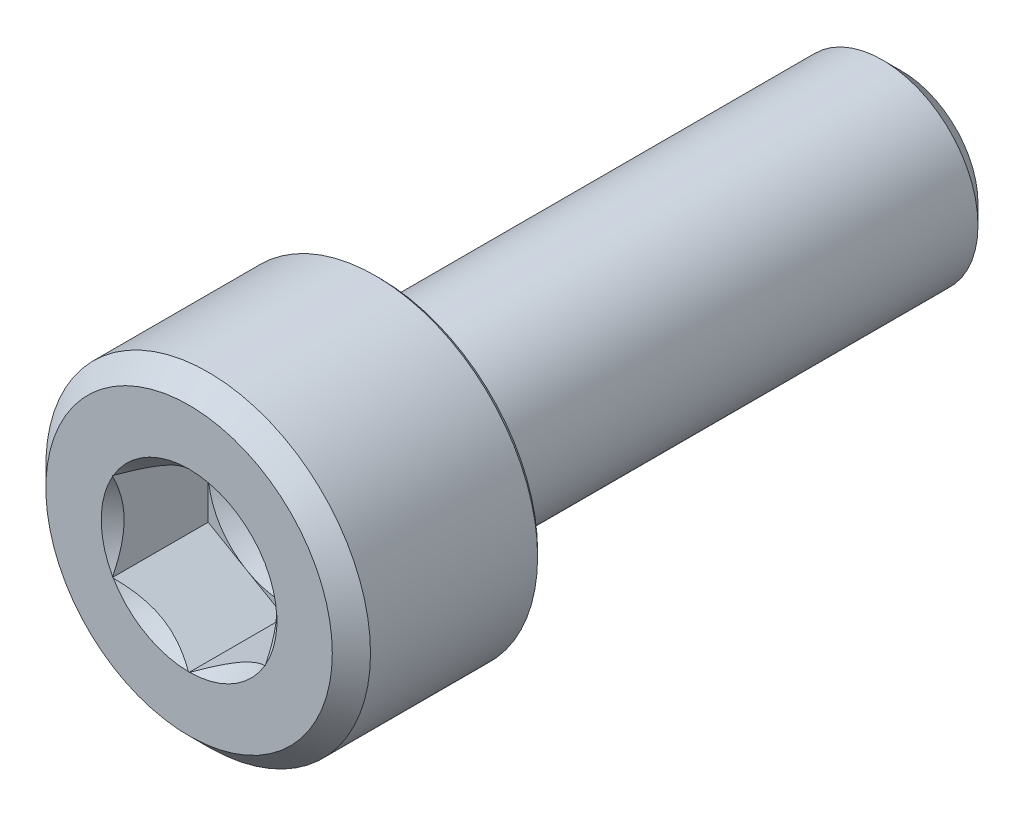
ISO-10303-21;
HEADER;
FILE_DESCRIPTION(('STEP AP214'),'2;1');
FILE_NAME('part.step','',(''),(''),'','','');
FILE_SCHEMA(('AUTOMOTIVE_DESIGN { 1 0 10303 214 1 1 1 1 }'));
ENDSEC;
DATA;
#1=APPLICATION_CONTEXT('core data for automotive mechanical design processes');
#2=APPLICATION_PROTOCOL_DEFINITION('international standard','automotive_design',2000,#1);
#3=PRODUCT_CONTEXT('',#1,'mechanical');
#4=PRODUCT('Part','Part','',(#3));
#5=PRODUCT_RELATED_PRODUCT_CATEGORY('part','',(#4));
#6=PRODUCT_DEFINITION_FORMATION('','',#4);
#7=PRODUCT_DEFINITION_CONTEXT('part definition',#1,'design');
#8=PRODUCT_DEFINITION('design','',#6,#7);
#9=PRODUCT_DEFINITION_SHAPE('','',#8);
#10=(LENGTH_UNIT() NAMED_UNIT(*) SI_UNIT(.MILLI.,.METRE.));
#11=(NAMED_UNIT(*) PLANE_ANGLE_UNIT() SI_UNIT($,.RADIAN.));
#12=(NAMED_UNIT(*) SI_UNIT($,.STERADIAN.) SOLID_ANGLE_UNIT());
#13=UNCERTAINTY_MEASURE_WITH_UNIT(LENGTH_MEASURE(1.E-05),#10,'distance_accuracy_value','');
#14=(GEOMETRIC_REPRESENTATION_CONTEXT(3) GLOBAL_UNCERTAINTY_ASSIGNED_CONTEXT((#13)) GLOBAL_UNIT_ASSIGNED_CONTEXT((#10,
#11,#12)) REPRESENTATION_CONTEXT('',''));
#15=CARTESIAN_POINT('',(0.,0.,0.));
#16=DIRECTION('',(0.,0.,1.));
#17=DIRECTION('',(1.,0.,0.));
#18=AXIS2_PLACEMENT_3D('',#15,#16,#17);
#19=CARTESIAN_POINT('',(0.,0.,3.65470053837925));
#20=DIRECTION('',(0.,0.,1.));
#21=DIRECTION('',(1.,0.,0.));
#22=AXIS2_PLACEMENT_3D('',#19,#20,#21);
#23=CONICAL_SURFACE('',#22,2.3,0.785398163397447);
#24=CARTESIAN_POINT('',(0.,0.,3.65470053837925));
#25=DIRECTION('',(0.,0.,1.));
#26=DIRECTION('',(1.,0.,0.));
#27=AXIS2_PLACEMENT_3D('',#24,#25,#26);
#28=CIRCLE('',#27,2.3);
#29=CARTESIAN_POINT('',(1.9836157786453,1.16415997298885,3.65470053837925));
#30=VERTEX_POINT('',#29);
#31=CARTESIAN_POINT('',(0.0163842213546962,2.2999416421489,3.65470053837925));
#32=VERTEX_POINT('',#31);
#33=EDGE_CURVE('E288',#30,#32,#28,.T.);
#34=ORIENTED_EDGE('',*,*,#33,.T.);
#35=CARTESIAN_POINT('',(0.0160335219124527,2.30014411856629,3.65490053837925));
#36=CARTESIAN_POINT('',(0.0838218716356483,2.26100649660568,3.61626977955249));
#37=CARTESIAN_POINT('',(0.152733940109913,2.22122009532165,3.5799513522365));
#38=CARTESIAN_POINT('',(0.293197345556135,2.14012351037598,3.513531403163));
#39=CARTESIAN_POINT('',(0.364761220332721,2.09880608800947,3.48346554819174));
#40=CARTESIAN_POINT('',(0.509055151253177,2.01549794815011,3.43200858947481));
#41=CARTESIAN_POINT('',(0.581750643043778,1.97352718639594,3.41049187089558));
#42=CARTESIAN_POINT('',(0.728695013519788,1.88868881454571,3.3773868739903));
#43=CARTESIAN_POINT('',(0.802939747411757,1.84582359744727,3.36577490198982));
#44=CARTESIAN_POINT('',(0.931694200760393,1.77148717914707,3.35527820444975));
#45=CARTESIAN_POINT('',(0.986050156804239,1.7401047532931,3.35378190690452));
#46=CARTESIAN_POINT('',(1.09466381191244,1.67739663027871,3.35670481363054));
#47=CARTESIAN_POINT('',(1.14892147075466,1.64607095634056,3.36112605255251));
#48=CARTESIAN_POINT('',(1.25691420441069,1.58372132249372,3.37563190528028));
#49=CARTESIAN_POINT('',(1.31064866719856,1.55269771593839,3.38572249177389));
#50=CARTESIAN_POINT('',(1.41718462269261,1.49118915335552,3.41101533780433));
#51=CARTESIAN_POINT('',(1.46998619003367,1.46070415423753,3.42621718645553));
#52=CARTESIAN_POINT('',(1.60199890807377,1.38448657594063,3.47022049295055));
#53=CARTESIAN_POINT('',(1.68047591324345,1.33917785588071,3.50196798692223));
#54=CARTESIAN_POINT('',(1.79595644222972,1.27250514138433,3.55539885052604));
#55=CARTESIAN_POINT('',(1.83402494324654,1.25052628207463,3.57414666618547));
#56=CARTESIAN_POINT('',(1.90948572309096,1.20695898051819,3.61332385139232));
#57=CARTESIAN_POINT('',(1.94687833497586,1.18537034598074,3.63375236357787));
#58=CARTESIAN_POINT('',(1.98396647808799,1.16395749657121,3.6549005383795));
#59=B_SPLINE_CURVE_WITH_KNOTS('',3,(#35,#36,#37,#38,#39,#40,#41,#42,#43,#44,#45,#46,#47,#48,#49,
#50,#51,#52,#53,#54,#55,#56,#57,#58),.UNSPECIFIED.,.F.,.F.,(4,2,2,2,2,2,2,2,2,2,2,4),(0.,
0.262041445010615,0.525538972003709,0.785007390559774,1.04385336605311,1.23193452890288,
1.4200803770827,1.60842481058421,1.79675410701709,2.08425218234595,2.22759444831597,
2.3708640401824),.UNSPECIFIED.);
#60=EDGE_CURVE('E246',#32,#30,#59,.T.);
#61=ORIENTED_EDGE('',*,*,#60,.T.);
#62=EDGE_LOOP('',(#34,#61));
#63=FACE_BOUND('',#62,.T.);
#64=ADVANCED_FACE('F36',(#63),#23,.F.);
#65=CARTESIAN_POINT('',(1.99999999999999,-1.13578166916007,3.65470053837925));
#66=VERTEX_POINT('',#65);
#67=CARTESIAN_POINT('',(1.99999999999999,1.13578166916007,3.65470053837925));
#68=VERTEX_POINT('',#67);
#69=EDGE_CURVE('E284',#66,#68,#28,.T.);
#70=ORIENTED_EDGE('',*,*,#69,.T.);
#71=CARTESIAN_POINT('',(1.99999999999999,3.4837056683404,5.37169010565809));
#72=CARTESIAN_POINT('',(1.99999999999999,3.38064544243507,5.28234698327698));
#73=CARTESIAN_POINT('',(1.99999999999999,3.27712654861634,5.19352202146325));
#74=CARTESIAN_POINT('',(1.99999999999999,3.06881584268026,5.01727790635607));
#75=CARTESIAN_POINT('',(1.99999999999999,2.964023447985,4.92985944251006));
#76=CARTESIAN_POINT('',(1.99999999999999,2.75047598433241,4.75489125618626));
#77=CARTESIAN_POINT('',(1.99999999999999,2.641685240832,4.66738490275798));
#78=CARTESIAN_POINT('',(1.99999999999999,2.42205041382861,4.49503242825231));
#79=CARTESIAN_POINT('',(1.99999999999999,2.31120685197181,4.41018564570945));
#80=CARTESIAN_POINT('',(1.99999999999999,2.0866375627447,4.24404809932447));
#81=CARTESIAN_POINT('',(1.99999999999999,1.97290816048253,4.16276227020368));
#82=CARTESIAN_POINT('',(1.99999999999999,1.74170238089295,4.00542360188487));
#83=CARTESIAN_POINT('',(1.99999999999999,1.62422304260943,3.92937505552962));
#84=CARTESIAN_POINT('',(1.99999999999999,1.38535336067468,3.78577771549349));
#85=CARTESIAN_POINT('',(1.99999999999999,1.26400028620497,3.71816774062344));
#86=CARTESIAN_POINT('',(1.99999999999999,1.01530632042797,3.59506201192209));
#87=CARTESIAN_POINT('',(1.99999999999999,0.887976987363086,3.53954395757193));
#88=CARTESIAN_POINT('',(1.99999999999999,0.690514411668279,3.46962905630233));
#89=CARTESIAN_POINT('',(1.99999999999999,0.622814904881047,3.44839077860405));
#90=CARTESIAN_POINT('',(1.99999999999999,0.48582308189195,3.41180277483204));
#91=CARTESIAN_POINT('',(1.99999999999999,0.416531021818052,3.39645210879012));
#92=CARTESIAN_POINT('',(1.99999999999999,0.277188402722413,3.37265910234162));
#93=CARTESIAN_POINT('',(1.99999999999999,0.207145152564436,3.36417475921466));
#94=CARTESIAN_POINT('',(1.99999999999999,0.0665510108308115,3.35457908188773));
#95=CARTESIAN_POINT('',(1.99999999999999,-0.00399982689904975,3.35346697684417));
#96=CARTESIAN_POINT('',(1.99999999999999,-0.144908272635511,3.35870484143565));
#97=CARTESIAN_POINT('',(1.99999999999999,-0.215265516520849,3.3650643882304));
#98=CARTESIAN_POINT('',(1.99999999999999,-0.354985397066574,3.38478048863059));
#99=CARTESIAN_POINT('',(1.99999999999999,-0.424347835333938,3.39813841851741));
#100=CARTESIAN_POINT('',(1.99999999999999,-0.562067833775433,3.43109464086447));
#101=CARTESIAN_POINT('',(1.99999999999999,-0.63041478174547,3.45073650875763));
#102=CARTESIAN_POINT('',(1.99999999999999,-0.765375927719188,3.49519990986254));
#103=CARTESIAN_POINT('',(1.99999999999999,-0.831990107140475,3.52002149859642));
#104=CARTESIAN_POINT('',(1.99999999999999,-0.978344560911979,3.57995191814828));
#105=CARTESIAN_POINT('',(1.99999999999999,-1.05764831161053,3.61611784331519));
#106=CARTESIAN_POINT('',(1.99999999999999,-1.21389410177411,3.69327289999961));
#107=CARTESIAN_POINT('',(1.99999999999999,-1.29083474353057,3.73426481922344));
#108=CARTESIAN_POINT('',(1.99999999999999,-1.44278995357122,3.81999992675208));
#109=CARTESIAN_POINT('',(1.99999999999999,-1.51780019983944,3.86475071309076));
#110=CARTESIAN_POINT('',(1.99999999999999,-1.66603498380282,3.95706725542144));
#111=CARTESIAN_POINT('',(1.99999999999999,-1.73925987276436,4.0046324512678));
#112=CARTESIAN_POINT('',(1.99999999999999,-1.88461254139945,4.1022172072051));
#113=CARTESIAN_POINT('',(1.99999999999999,-1.95673244637467,4.15224844258036));
#114=CARTESIAN_POINT('',(1.99999999999999,-2.0997242908128,4.25406769949909));
#115=CARTESIAN_POINT('',(1.99999999999999,-2.17059613561162,4.30585585343864));
#116=CARTESIAN_POINT('',(1.99999999999999,-2.38148237368524,4.463180913558));
#117=CARTESIAN_POINT('',(1.99999999999999,-2.51994258602376,4.5707985846889));
#118=CARTESIAN_POINT('',(1.99999999999999,-2.79804246494446,4.79299661482444));
#119=CARTESIAN_POINT('',(1.99999999999999,-2.93759167203103,4.90768908226659));
#120=CARTESIAN_POINT('',(1.99999999999999,-3.1444630544826,5.08112887345926));
#121=CARTESIAN_POINT('',(1.99999999999999,-3.21264477531068,5.13885589177048));
#122=CARTESIAN_POINT('',(1.99999999999999,-3.34852121502818,5.25487333724658));
#123=CARTESIAN_POINT('',(1.99999999999999,-3.416215959252,5.31316373472708));
#124=CARTESIAN_POINT('',(1.99999999999999,-3.4837056683404,5.37169010565809));
#125=B_SPLINE_CURVE_WITH_KNOTS('',3,(#71,#72,#73,#74,#75,#76,#77,#78,#79,#80,#81,#82,#83,#84,
#85,#86,#87,#88,#89,#90,#91,#92,#93,#94,#95,#96,#97,#98,#99,#100,#101,#102,#103,#104,#105,#106,
#107,#108,#109,#110,#111,#112,#113,#114,#115,#116,#117,#118,#119,#120,#121,#122,#123,#124),
.UNSPECIFIED.,.F.,.F.,(4,2,2,2,2,2,2,2,2,2,2,2,2,2,2,2,2,2,2,2,2,2,2,2,2,2,4),(0.,
0.409194059342149,0.818582938159623,1.23740286458969,1.65611778565292,2.07539569972372,
2.49501329059275,2.91138596426504,3.32698411557696,3.53962974468632,3.75224141037833,
3.96354244131151,4.17482137819207,4.38637142804252,4.59796309632632,4.81105504535252,
5.02414927865809,5.28541077842604,5.54682394170922,5.80877885453894,6.07068180530281,
6.33397327955596,6.59728463892513,7.12327074296493,7.66512681121564,7.93313622584972,
8.20113159526818),.UNSPECIFIED.);
#126=EDGE_CURVE('E254',#68,#66,#125,.T.);
#127=ORIENTED_EDGE('',*,*,#126,.T.);
#128=EDGE_LOOP('',(#70,#127));
#129=FACE_BOUND('',#128,.T.);
#130=ADVANCED_FACE('F349',(#129),#23,.F.);
#131=CARTESIAN_POINT('',(0.0163842213546949,-2.2999416421489,3.65470053837925));
#132=VERTEX_POINT('',#131);
#133=CARTESIAN_POINT('',(1.9836157786453,-1.16415997298885,3.65470053837925));
#134=VERTEX_POINT('',#133);
#135=EDGE_CURVE('E287',#132,#134,#28,.T.);
#136=ORIENTED_EDGE('',*,*,#135,.T.);
#137=CARTESIAN_POINT('',(1.98396647808799,-1.16395749657121,3.6549005383795));
#138=CARTESIAN_POINT('',(1.91617812836477,-1.20309511853183,3.61626977955272));
#139=CARTESIAN_POINT('',(1.84726605989048,-1.24288151981587,3.5799513522367));
#140=CARTESIAN_POINT('',(1.7068026544442,-1.32397810476157,3.51353140316315));
#141=CARTESIAN_POINT('',(1.63523877966758,-1.3652955271281,3.48346554819186));
#142=CARTESIAN_POINT('',(1.49094484874707,-1.44860366698749,3.43200858947489));
#143=CARTESIAN_POINT('',(1.41824935695644,-1.49057442874169,3.41049187089564));
#144=CARTESIAN_POINT('',(1.27130498648036,-1.57541280059195,3.37738687399032));
#145=CARTESIAN_POINT('',(1.19706025258836,-1.61827801769041,3.36577490198983));
#146=CARTESIAN_POINT('',(1.06830579923969,-1.69261443599063,3.35527820444975));
#147=CARTESIAN_POINT('',(1.01394984319584,-1.7239968618446,3.35378190690453));
#148=CARTESIAN_POINT('',(0.905336188087633,-1.78670498485899,3.35670481363054));
#149=CARTESIAN_POINT('',(0.851078529245416,-1.81803065879715,3.3611260525525));
#150=CARTESIAN_POINT('',(0.743085795589382,-1.88038029264398,3.37563190528026));
#151=CARTESIAN_POINT('',(0.689351332801517,-1.91140389919932,3.38572249177387));
#152=CARTESIAN_POINT('',(0.582815377307459,-1.97291246178218,3.41101533780431));
#153=CARTESIAN_POINT('',(0.530013809966401,-2.00339746090018,3.42621718645551));
#154=CARTESIAN_POINT('',(0.398001091926369,-2.07961503919704,3.4702204929505));
#155=CARTESIAN_POINT('',(0.31952408675675,-2.12492375925692,3.50196798692214));
#156=CARTESIAN_POINT('',(0.204043557770575,-2.19159647375325,3.5553988505259));
#157=CARTESIAN_POINT('',(0.165975056753787,-2.21357533306294,3.5741466661853));
#158=CARTESIAN_POINT('',(0.0905142769094184,-2.25714263461934,3.61332385139212));
#159=CARTESIAN_POINT('',(0.0531216650245492,-2.27873126915677,3.63375236357764));
#160=CARTESIAN_POINT('',(0.0160335219124515,-2.30014411856629,3.65490053837925));
#161=B_SPLINE_CURVE_WITH_KNOTS('',3,(#137,#138,#139,#140,#141,#142,#143,#144,#145,#146,#147,
#148,#149,#150,#151,#152,#153,#154,#155,#156,#157,#158,#159,#160),.UNSPECIFIED.,.F.,.F.,(4,2,2,
2,2,2,2,2,2,2,2,4),(0.,0.262041445010732,0.525538972003944,0.785007390560127,1.04385336605358,
1.23193452890336,1.42008037708318,1.60842481058469,1.79675410701758,2.08425218234619,
2.22759444831609,2.3708640401824),.UNSPECIFIED.);
#162=EDGE_CURVE('E315',#134,#132,#161,.T.);
#163=ORIENTED_EDGE('',*,*,#162,.T.);
#164=EDGE_LOOP('',(#136,#163));
#165=FACE_BOUND('',#164,.T.);
#166=ADVANCED_FACE('F314',(#165),#23,.F.);
#167=CARTESIAN_POINT('',(-1.9836157786453,-1.16415997298885,3.65470053837925));
#168=VERTEX_POINT('',#167);
#169=CARTESIAN_POINT('',(-0.0163842213546971,-2.2999416421489,3.65470053837925));
#170=VERTEX_POINT('',#169);
#171=EDGE_CURVE('E316',#168,#170,#28,.T.);
#172=ORIENTED_EDGE('',*,*,#171,.T.);
#173=CARTESIAN_POINT('',(-0.0160335219124554,-2.30014411856629,3.65490053837925));
#174=CARTESIAN_POINT('',(-0.0838218716356508,-2.26100649660568,3.61626977955249));
#175=CARTESIAN_POINT('',(-0.152733940109915,-2.22122009532165,3.5799513522365));
#176=CARTESIAN_POINT('',(-0.293197345556137,-2.14012351037598,3.513531403163));
#177=CARTESIAN_POINT('',(-0.364761220332723,-2.09880608800947,3.48346554819174));
#178=CARTESIAN_POINT('',(-0.509055151253179,-2.01549794815011,3.43200858947481));
#179=CARTESIAN_POINT('',(-0.581750643043781,-1.97352718639594,3.41049187089558));
#180=CARTESIAN_POINT('',(-0.72869501351979,-1.88868881454571,3.3773868739903));
#181=CARTESIAN_POINT('',(-0.802939747411759,-1.84582359744727,3.36577490198982));
#182=CARTESIAN_POINT('',(-0.931694200760395,-1.77148717914707,3.35527820444975));
#183=CARTESIAN_POINT('',(-0.986050156804241,-1.7401047532931,3.35378190690453));
#184=CARTESIAN_POINT('',(-1.09466381191245,-1.67739663027871,3.35670481363054));
#185=CARTESIAN_POINT('',(-1.14892147075466,-1.64607095634056,3.36112605255251));
#186=CARTESIAN_POINT('',(-1.25691420441069,-1.58372132249372,3.37563190528028));
#187=CARTESIAN_POINT('',(-1.31064866719856,-1.55269771593839,3.38572249177389));
#188=CARTESIAN_POINT('',(-1.41718462269261,-1.49118915335552,3.41101533780433));
#189=CARTESIAN_POINT('',(-1.46998619003367,-1.46070415423753,3.42621718645553));
#190=CARTESIAN_POINT('',(-1.60199890807377,-1.38448657594063,3.47022049295055));
#191=CARTESIAN_POINT('',(-1.68047591324345,-1.33917785588071,3.50196798692223));
#192=CARTESIAN_POINT('',(-1.79595644222972,-1.27250514138433,3.55539885052604));
#193=CARTESIAN_POINT('',(-1.83402494324653,-1.25052628207463,3.57414666618547));
#194=CARTESIAN_POINT('',(-1.90948572309096,-1.20695898051819,3.61332385139232));
#195=CARTESIAN_POINT('',(-1.94687833497586,-1.18537034598074,3.63375236357787));
#196=CARTESIAN_POINT('',(-1.98396647808799,-1.16395749657121,3.6549005383795));
#197=B_SPLINE_CURVE_WITH_KNOTS('',3,(#173,#174,#175,#176,#177,#178,#179,#180,#181,#182,#183,
#184,#185,#186,#187,#188,#189,#190,#191,#192,#193,#194,#195,#196),.UNSPECIFIED.,.F.,.F.,(4,2,2,
2,2,2,2,2,2,2,2,4),(0.,0.262041445010615,0.525538972003708,0.785007390559773,1.04385336605311,
1.23193452890288,1.4200803770827,1.60842481058421,1.79675410701709,2.08425218234595,
2.22759444831596,2.37086404018239),.UNSPECIFIED.);
#198=EDGE_CURVE('E350',#170,#168,#197,.T.);
#199=ORIENTED_EDGE('',*,*,#198,.T.);
#200=EDGE_LOOP('',(#172,#199));
#201=FACE_BOUND('',#200,.T.);
#202=ADVANCED_FACE('F383',(#201),#23,.F.);
#203=CARTESIAN_POINT('',(-2.,1.13578166916006,3.65470053837925));
#204=VERTEX_POINT('',#203);
#205=CARTESIAN_POINT('',(-2.,-1.13578166916006,3.65470053837925));
#206=VERTEX_POINT('',#205);
#207=EDGE_CURVE('E318',#204,#206,#28,.T.);
#208=ORIENTED_EDGE('',*,*,#207,.T.);
#209=CARTESIAN_POINT('',(-2.,-3.4837056683404,5.37169010565808));
#210=CARTESIAN_POINT('',(-2.,-3.38064544243506,5.28234698327697));
#211=CARTESIAN_POINT('',(-2.,-3.27712654861633,5.19352202146325));
#212=CARTESIAN_POINT('',(-2.,-3.06881584268025,5.01727790635607));
#213=CARTESIAN_POINT('',(-2.,-2.964023447985,4.92985944251005));
#214=CARTESIAN_POINT('',(-2.,-2.7504759843324,4.75489125618626));
#215=CARTESIAN_POINT('',(-2.,-2.641685240832,4.66738490275798));
#216=CARTESIAN_POINT('',(-2.,-2.4220504138286,4.49503242825231));
#217=CARTESIAN_POINT('',(-2.,-2.3112068519718,4.41018564570945));
#218=CARTESIAN_POINT('',(-2.,-2.08663756274469,4.24404809932447));
#219=CARTESIAN_POINT('',(-2.,-1.97290816048252,4.16276227020368));
#220=CARTESIAN_POINT('',(-2.,-1.74170238089294,4.00542360188487));
#221=CARTESIAN_POINT('',(-2.,-1.62422304260942,3.92937505552962));
#222=CARTESIAN_POINT('',(-2.,-1.38535336067467,3.78577771549349));
#223=CARTESIAN_POINT('',(-2.,-1.26400028620496,3.71816774062344));
#224=CARTESIAN_POINT('',(-2.,-1.01530632042796,3.59506201192209));
#225=CARTESIAN_POINT('',(-2.,-0.88797698736308,3.53954395757194));
#226=CARTESIAN_POINT('',(-2.,-0.690514411668273,3.46962905630233));
#227=CARTESIAN_POINT('',(-2.,-0.622814904881041,3.44839077860406));
#228=CARTESIAN_POINT('',(-2.,-0.485823081891944,3.41180277483205));
#229=CARTESIAN_POINT('',(-2.,-0.416531021818045,3.39645210879013));
#230=CARTESIAN_POINT('',(-2.,-0.277188402722407,3.37265910234162));
#231=CARTESIAN_POINT('',(-2.,-0.20714515256443,3.36417475921467));
#232=CARTESIAN_POINT('',(-2.,-0.0665510108308056,3.35457908188774));
#233=CARTESIAN_POINT('',(-2.,0.00399982689905562,3.35346697684417));
#234=CARTESIAN_POINT('',(-2.,0.144908272635517,3.35870484143565));
#235=CARTESIAN_POINT('',(-2.,0.215265516520855,3.3650643882304));
#236=CARTESIAN_POINT('',(-2.,0.354985397066579,3.3847804886306));
#237=CARTESIAN_POINT('',(-2.,0.424347835333943,3.39813841851741));
#238=CARTESIAN_POINT('',(-2.,0.562067833775438,3.43109464086447));
#239=CARTESIAN_POINT('',(-2.,0.630414781745475,3.45073650875764));
#240=CARTESIAN_POINT('',(-2.,0.765375927719192,3.49519990986254));
#241=CARTESIAN_POINT('',(-2.,0.831990107140479,3.52002149859642));
#242=CARTESIAN_POINT('',(-2.,0.978344560911984,3.57995191814829));
#243=CARTESIAN_POINT('',(-2.,1.05764831161054,3.6161178433152));
#244=CARTESIAN_POINT('',(-2.,1.21389410177412,3.69327289999962));
#245=CARTESIAN_POINT('',(-2.,1.29083474353057,3.73426481922344));
#246=CARTESIAN_POINT('',(-2.,1.44278995357123,3.81999992675209));
#247=CARTESIAN_POINT('',(-2.,1.51780019983944,3.86475071309077));
#248=CARTESIAN_POINT('',(-2.,1.66603498380283,3.95706725542145));
#249=CARTESIAN_POINT('',(-2.,1.73925987276437,4.00463245126781));
#250=CARTESIAN_POINT('',(-2.,1.88461254139946,4.10221720720511));
#251=CARTESIAN_POINT('',(-2.,1.95673244637468,4.15224844258037));
#252=CARTESIAN_POINT('',(-2.,2.09972429081281,4.2540676994991));
#253=CARTESIAN_POINT('',(-2.,2.17059613561163,4.30585585343865));
#254=CARTESIAN_POINT('',(-2.,2.38148237368525,4.46318091355802));
#255=CARTESIAN_POINT('',(-2.,2.51994258602377,4.57079858468891));
#256=CARTESIAN_POINT('',(-2.,2.79804246494447,4.79299661482445));
#257=CARTESIAN_POINT('',(-2.,2.93759167203104,4.9076890822666));
#258=CARTESIAN_POINT('',(-2.,3.1444630544826,5.08112887345927));
#259=CARTESIAN_POINT('',(-2.,3.21264477531068,5.13885589177049));
#260=CARTESIAN_POINT('',(-2.,3.34852121502817,5.25487333724658));
#261=CARTESIAN_POINT('',(-2.,3.416215959252,5.31316373472709));
#262=CARTESIAN_POINT('',(-2.,3.4837056683404,5.37169010565809));
#263=B_SPLINE_CURVE_WITH_KNOTS('',3,(#209,#210,#211,#212,#213,#214,#215,#216,#217,#218,#219,
#220,#221,#222,#223,#224,#225,#226,#227,#228,#229,#230,#231,#232,#233,#234,#235,#236,#237,#238,
#239,#240,#241,#242,#243,#244,#245,#246,#247,#248,#249,#250,#251,#252,#253,#254,#255,#256,#257,
#258,#259,#260,#261,#262),.UNSPECIFIED.,.F.,.F.,(4,2,2,2,2,2,2,2,2,2,2,2,2,2,2,2,2,2,2,2,2,2,2,
2,2,2,4),(0.,0.40919405934215,0.818582938159622,1.23740286458969,1.65611778565292,
2.07539569972372,2.49501329059275,2.91138596426504,3.32698411557695,3.53962974468631,
3.75224141037833,3.96354244131151,4.17482137819207,4.38637142804252,4.59796309632632,
4.81105504535252,5.02414927865809,5.28541077842603,5.54682394170922,5.80877885453893,
6.07068180530281,6.33397327955596,6.59728463892513,7.12327074296493,7.66512681121564,
7.93313622584971,8.20113159526817),.UNSPECIFIED.);
#264=EDGE_CURVE('E222',#206,#204,#263,.T.);
#265=ORIENTED_EDGE('',*,*,#264,.T.);
#266=EDGE_LOOP('',(#208,#265));
#267=FACE_BOUND('',#266,.T.);
#268=ADVANCED_FACE('F377',(#267),#23,.F.);
#269=CARTESIAN_POINT('',(-0.0163842213547029,2.2999416421489,3.65470053837925));
#270=VERTEX_POINT('',#269);
#271=CARTESIAN_POINT('',(-1.9836157786453,1.16415997298885,3.65470053837925));
#272=VERTEX_POINT('',#271);
#273=EDGE_CURVE('E322',#270,#272,#28,.T.);
#274=ORIENTED_EDGE('',*,*,#273,.T.);
#275=CARTESIAN_POINT('',(-1.98396647808799,1.16395749657121,3.6549005383795));
#276=CARTESIAN_POINT('',(-1.91617812836477,1.20309511853183,3.61626977955272));
#277=CARTESIAN_POINT('',(-1.84726605989048,1.24288151981588,3.5799513522367));
#278=CARTESIAN_POINT('',(-1.7068026544442,1.32397810476158,3.51353140316315));
#279=CARTESIAN_POINT('',(-1.63523877966758,1.36529552712811,3.48346554819186));
#280=CARTESIAN_POINT('',(-1.49094484874707,1.4486036669875,3.43200858947489));
#281=CARTESIAN_POINT('',(-1.41824935695644,1.49057442874169,3.41049187089564));
#282=CARTESIAN_POINT('',(-1.27130498648037,1.57541280059195,3.37738687399032));
#283=CARTESIAN_POINT('',(-1.19706025258836,1.61827801769041,3.36577490198983));
#284=CARTESIAN_POINT('',(-1.06830579923969,1.69261443599063,3.35527820444975));
#285=CARTESIAN_POINT('',(-1.01394984319585,1.7239968618446,3.35378190690453));
#286=CARTESIAN_POINT('',(-0.905336188087638,1.786704984859,3.35670481363054));
#287=CARTESIAN_POINT('',(-0.85107852924542,1.81803065879715,3.3611260525525));
#288=CARTESIAN_POINT('',(-0.743085795589386,1.88038029264398,3.37563190528027));
#289=CARTESIAN_POINT('',(-0.689351332801521,1.91140389919932,3.38572249177387));
#290=CARTESIAN_POINT('',(-0.582815377307463,1.97291246178219,3.41101533780431));
#291=CARTESIAN_POINT('',(-0.530013809966405,2.00339746090018,3.42621718645551));
#292=CARTESIAN_POINT('',(-0.398001091926374,2.07961503919705,3.4702204929505));
#293=CARTESIAN_POINT('',(-0.319524086756756,2.12492375925692,3.50196798692215));
#294=CARTESIAN_POINT('',(-0.204043557770582,2.19159647375325,3.5553988505259));
#295=CARTESIAN_POINT('',(-0.165975056753794,2.21357533306294,3.57414666618531));
#296=CARTESIAN_POINT('',(-0.0905142769094257,2.25714263461934,3.61332385139212));
#297=CARTESIAN_POINT('',(-0.0531216650245568,2.27873126915677,3.63375236357764));
#298=CARTESIAN_POINT('',(-0.0160335219124594,2.30014411856629,3.65490053837925));
#299=B_SPLINE_CURVE_WITH_KNOTS('',3,(#275,#276,#277,#278,#279,#280,#281,#282,#283,#284,#285,
#286,#287,#288,#289,#290,#291,#292,#293,#294,#295,#296,#297,#298),.UNSPECIFIED.,.F.,.F.,(4,2,2,
2,2,2,2,2,2,2,2,4),(0.,0.26204144501073,0.525538972003941,0.785007390560122,1.04385336605357,
1.23193452890335,1.42008037708318,1.60842481058469,1.79675410701757,2.08425218234618,
2.22759444831608,2.37086404018239),.UNSPECIFIED.);
#300=EDGE_CURVE('E204',#272,#270,#299,.T.);
#301=ORIENTED_EDGE('',*,*,#300,.T.);
#302=EDGE_LOOP('',(#274,#301));
#303=FACE_BOUND('',#302,.T.);
#304=ADVANCED_FACE('F229',(#303),#23,.F.);
#305=CARTESIAN_POINT('',(0.,3.75,3.65470053837925));
#306=DIRECTION('',(0.,0.,-1.));
#307=DIRECTION('',(-1.,0.,0.));
#308=AXIS2_PLACEMENT_3D('',#305,#306,#307);
#309=PLANE('',#308);
#310=ORIENTED_EDGE('',*,*,#33,.F.);
#311=DIRECTION('',(-0.866025403784439,0.5,0.));
#312=VECTOR('',#311,1.);
#313=CARTESIAN_POINT('',(1.99999999999999,1.15470053837925,3.65470053837925));
#314=LINE('',#313,#312);
#315=CARTESIAN_POINT('',(1.99999999999999,1.15470053837925,3.65470053837925));
#316=VERTEX_POINT('',#315);
#317=EDGE_CURVE('E185',#316,#30,#314,.T.);
#318=ORIENTED_EDGE('',*,*,#317,.F.);
#319=DIRECTION('',(0.,-1.,0.));
#320=VECTOR('',#319,1.);
#321=CARTESIAN_POINT('',(1.99999999999999,3.75,3.65470053837925));
#322=LINE('',#321,#320);
#323=EDGE_CURVE('E11',#316,#68,#322,.T.);
#324=ORIENTED_EDGE('',*,*,#323,.T.);
#325=ORIENTED_EDGE('',*,*,#69,.F.);
#326=DIRECTION('',(0.,1.,0.));
#327=VECTOR('',#326,1.);
#328=CARTESIAN_POINT('',(1.99999999999999,-1.15470053837925,3.65470053837925));
#329=LINE('',#328,#327);
#330=CARTESIAN_POINT('',(1.99999999999999,-1.15470053837925,3.65470053837925));
#331=VERTEX_POINT('',#330);
#332=EDGE_CURVE('E155',#331,#66,#329,.T.);
#333=ORIENTED_EDGE('',*,*,#332,.F.);
#334=DIRECTION('',(-0.866025403784439,-0.5,0.));
#335=VECTOR('',#334,1.);
#336=CARTESIAN_POINT('',(2.62379763209582,-0.794550807568877,3.65470053837925));
#337=LINE('',#336,#335);
#338=EDGE_CURVE('E44',#331,#134,#337,.T.);
#339=ORIENTED_EDGE('',*,*,#338,.T.);
#340=ORIENTED_EDGE('',*,*,#135,.F.);
#341=DIRECTION('',(0.866025403784439,0.5,0.));
#342=VECTOR('',#341,1.);
#343=CARTESIAN_POINT('',(0.,-2.3094010767585,3.65470053837925));
#344=LINE('',#343,#342);
#345=CARTESIAN_POINT('',(0.,-2.3094010767585,3.65470053837925));
#346=VERTEX_POINT('',#345);
#347=EDGE_CURVE('E196',#346,#132,#344,.T.);
#348=ORIENTED_EDGE('',*,*,#347,.F.);
#349=DIRECTION('',(-0.866025403784439,0.5,0.));
#350=VECTOR('',#349,1.);
#351=CARTESIAN_POINT('',(-2.62379763209582,-0.794550807568877,3.65470053837925));
#352=LINE('',#351,#350);
#353=EDGE_CURVE('E299',#346,#170,#352,.T.);
#354=ORIENTED_EDGE('',*,*,#353,.T.);
#355=ORIENTED_EDGE('',*,*,#171,.F.);
#356=DIRECTION('',(0.866025403784439,-0.5,0.));
#357=VECTOR('',#356,1.);
#358=CARTESIAN_POINT('',(-2.,-1.15470053837925,3.65470053837925));
#359=LINE('',#358,#357);
#360=CARTESIAN_POINT('',(-2.,-1.15470053837925,3.65470053837925));
#361=VERTEX_POINT('',#360);
#362=EDGE_CURVE('E193',#361,#168,#359,.T.);
#363=ORIENTED_EDGE('',*,*,#362,.F.);
#364=DIRECTION('',(0.,1.,0.));
#365=VECTOR('',#364,1.);
#366=CARTESIAN_POINT('',(-2.,3.75,3.65470053837925));
#367=LINE('',#366,#365);
#368=EDGE_CURVE('E295',#361,#206,#367,.T.);
#369=ORIENTED_EDGE('',*,*,#368,.T.);
#370=ORIENTED_EDGE('',*,*,#207,.F.);
#371=DIRECTION('',(0.,-1.,0.));
#372=VECTOR('',#371,1.);
#373=CARTESIAN_POINT('',(-2.,1.15470053837925,3.65470053837925));
#374=LINE('',#373,#372);
#375=CARTESIAN_POINT('',(-2.,1.15470053837925,3.65470053837925));
#376=VERTEX_POINT('',#375);
#377=EDGE_CURVE('E190',#376,#204,#374,.T.);
#378=ORIENTED_EDGE('',*,*,#377,.F.);
#379=DIRECTION('',(0.866025403784439,0.5,0.));
#380=VECTOR('',#379,1.);
#381=CARTESIAN_POINT('',(0.623797632095822,2.66955080756888,3.65470053837925));
#382=LINE('',#381,#380);
#383=EDGE_CURVE('E292',#376,#272,#382,.T.);
#384=ORIENTED_EDGE('',*,*,#383,.T.);
#385=ORIENTED_EDGE('',*,*,#273,.F.);
#386=DIRECTION('',(-0.866025403784439,-0.5,0.));
#387=VECTOR('',#386,1.);
#388=CARTESIAN_POINT('',(0.,2.3094010767585,3.65470053837925));
#389=LINE('',#388,#387);
#390=CARTESIAN_POINT('',(0.,2.3094010767585,3.65470053837925));
#391=VERTEX_POINT('',#390);
#392=EDGE_CURVE('E188',#391,#270,#389,.T.);
#393=ORIENTED_EDGE('',*,*,#392,.F.);
#394=DIRECTION('',(0.866025403784439,-0.5,0.));
#395=VECTOR('',#394,1.);
#396=CARTESIAN_POINT('',(-0.623797632095824,2.66955080756887,3.65470053837925));
#397=LINE('',#396,#395);
#398=EDGE_CURVE('E159',#391,#32,#397,.T.);
#399=ORIENTED_EDGE('',*,*,#398,.T.);
#400=EDGE_LOOP('',(#310,#318,#324,#325,#333,#339,#340,#348,#354,#355,#363,#369,#370,#378,#384,
#385,#393,#399));
#401=FACE_BOUND('',#400,.T.);
#402=CARTESIAN_POINT('',(0.,0.,3.65470053837925));
#403=DIRECTION('',(0.,0.,1.));
#404=DIRECTION('',(1.,0.,0.));
#405=AXIS2_PLACEMENT_3D('',#402,#403,#404);
#406=CIRCLE('',#405,3.75);
#407=CARTESIAN_POINT('',(3.75,0.,3.65470053837925));
#408=VERTEX_POINT('',#407);
#409=EDGE_CURVE('E281',#408,#408,#406,.T.);
#410=ORIENTED_EDGE('',*,*,#409,.T.);
#411=EDGE_LOOP('',(#410));
#412=FACE_BOUND('',#411,.T.);
#413=ADVANCED_FACE('F307',(#401,#412),#309,.F.);
#414=CARTESIAN_POINT('',(0.,0.,3.15470053837925));
#415=DIRECTION('',(0.,0.,-1.));
#416=DIRECTION('',(-1.,0.,0.));
#417=AXIS2_PLACEMENT_3D('',#414,#415,#416);
#418=CONICAL_SURFACE('',#417,4.25,0.785398163397448);
#419=ORIENTED_EDGE('',*,*,#409,.F.);
#420=EDGE_LOOP('',(#419));
#421=FACE_BOUND('',#420,.T.);
#422=CARTESIAN_POINT('',(0.,0.,3.15470053837925));
#423=DIRECTION('',(0.,0.,1.));
#424=DIRECTION('',(1.,0.,0.));
#425=AXIS2_PLACEMENT_3D('',#422,#423,#424);
#426=CIRCLE('',#425,4.25);
#427=CARTESIAN_POINT('',(4.25,0.,3.15470053837925));
#428=VERTEX_POINT('',#427);
#429=EDGE_CURVE('E278',#428,#428,#426,.T.);
#430=ORIENTED_EDGE('',*,*,#429,.T.);
#431=EDGE_LOOP('',(#430));
#432=FACE_BOUND('',#431,.T.);
#433=ADVANCED_FACE('F382',(#421,#432),#418,.T.);
#434=CARTESIAN_POINT('',(0.,0.,0.));
#435=DIRECTION('',(0.,0.,1.));
#436=DIRECTION('',(1.,0.,0.));
#437=AXIS2_PLACEMENT_3D('',#434,#435,#436);
#438=CYLINDRICAL_SURFACE('',#437,4.25);
#439=ORIENTED_EDGE('',*,*,#429,.F.);
#440=EDGE_LOOP('',(#439));
#441=FACE_BOUND('',#440,.T.);
#442=CARTESIAN_POINT('',(0.,0.,-1.22029946162075));
#443=DIRECTION('',(0.,0.,1.));
#444=DIRECTION('',(1.,0.,0.));
#445=AXIS2_PLACEMENT_3D('',#442,#443,#444);
#446=CIRCLE('',#445,4.25);
#447=CARTESIAN_POINT('',(4.25,0.,-1.22029946162075));
#448=VERTEX_POINT('',#447);
#449=EDGE_CURVE('E275',#448,#448,#446,.T.);
#450=ORIENTED_EDGE('',*,*,#449,.T.);
#451=EDGE_LOOP('',(#450));
#452=FACE_BOUND('',#451,.T.);
#453=ADVANCED_FACE('F460',(#441,#452),#438,.T.);
#454=CARTESIAN_POINT('',(0.,0.,-1.34529946162075));
#455=DIRECTION('',(0.,0.,1.));
#456=DIRECTION('',(1.,0.,0.));
#457=AXIS2_PLACEMENT_3D('',#454,#455,#456);
#458=CONICAL_SURFACE('',#457,4.125,0.785398163397449);
#459=ORIENTED_EDGE('',*,*,#449,.F.);
#460=EDGE_LOOP('',(#459));
#461=FACE_BOUND('',#460,.T.);
#462=CARTESIAN_POINT('',(0.,0.,-1.34529946162075));
#463=DIRECTION('',(0.,0.,1.));
#464=DIRECTION('',(1.,0.,0.));
#465=AXIS2_PLACEMENT_3D('',#462,#463,#464);
#466=CIRCLE('',#465,4.125);
#467=CARTESIAN_POINT('',(4.125,0.,-1.34529946162075));
#468=VERTEX_POINT('',#467);
#469=EDGE_CURVE('E272',#468,#468,#466,.T.);
#470=ORIENTED_EDGE('',*,*,#469,.T.);
#471=EDGE_LOOP('',(#470));
#472=FACE_BOUND('',#471,.T.);
#473=ADVANCED_FACE('F450',(#461,#472),#458,.T.);
#474=CARTESIAN_POINT('',(0.,2.5419560871661,-1.34529946162075));
#475=DIRECTION('',(0.,0.,1.));
#476=DIRECTION('',(1.,0.,0.));
#477=AXIS2_PLACEMENT_3D('',#474,#475,#476);
#478=PLANE('',#477);
#479=ORIENTED_EDGE('',*,*,#469,.F.);
#480=EDGE_LOOP('',(#479));
#481=FACE_BOUND('',#480,.T.);
#482=CARTESIAN_POINT('',(0.,0.,-1.34529946162075));
#483=DIRECTION('',(0.,0.,1.));
#484=DIRECTION('',(1.,0.,0.));
#485=AXIS2_PLACEMENT_3D('',#482,#483,#484);
#486=CIRCLE('',#485,2.5419560871661);
#487=CARTESIAN_POINT('',(2.5419560871661,0.,-1.34529946162075));
#488=VERTEX_POINT('',#487);
#489=EDGE_CURVE('E269',#488,#488,#486,.T.);
#490=ORIENTED_EDGE('',*,*,#489,.T.);
#491=EDGE_LOOP('',(#490));
#492=FACE_BOUND('',#491,.T.);
#493=ADVANCED_FACE('F440',(#481,#492),#478,.F.);
#494=CARTESIAN_POINT('',(0.,0.,-1.94529946162075));
#495=DIRECTION('',(0.,0.,1.));
#496=DIRECTION('',(1.,0.,0.));
#497=AXIS2_PLACEMENT_3D('',#494,#495,#496);
#498=CONICAL_SURFACE('',#497,2.5,0.0698131700797715);
#499=ORIENTED_EDGE('',*,*,#489,.F.);
#500=EDGE_LOOP('',(#499));
#501=FACE_BOUND('',#500,.T.);
#502=CARTESIAN_POINT('',(0.,0.,-1.94529946162075));
#503=DIRECTION('',(0.,0.,1.));
#504=DIRECTION('',(1.,0.,0.));
#505=AXIS2_PLACEMENT_3D('',#502,#503,#504);
#506=CIRCLE('',#505,2.5);
#507=CARTESIAN_POINT('',(2.5,0.,-1.94529946162075));
#508=VERTEX_POINT('',#507);
#509=EDGE_CURVE('E266',#508,#508,#506,.T.);
#510=ORIENTED_EDGE('',*,*,#509,.T.);
#511=EDGE_LOOP('',(#510));
#512=FACE_BOUND('',#511,.T.);
#513=ADVANCED_FACE('F430',(#501,#512),#498,.T.);
#514=CARTESIAN_POINT('',(0.,0.,0.));
#515=DIRECTION('',(0.,0.,1.));
#516=DIRECTION('',(1.,0.,0.));
#517=AXIS2_PLACEMENT_3D('',#514,#515,#516);
#518=CYLINDRICAL_SURFACE('',#517,2.5);
#519=ORIENTED_EDGE('',*,*,#509,.F.);
#520=EDGE_LOOP('',(#519));
#521=FACE_BOUND('',#520,.T.);
#522=CARTESIAN_POINT('',(0.,0.,-14.5));
#523=DIRECTION('',(0.,0.,1.));
#524=DIRECTION('',(1.,0.,0.));
#525=AXIS2_PLACEMENT_3D('',#522,#523,#524);
#526=CIRCLE('',#525,2.5);
#527=CARTESIAN_POINT('',(2.5,0.,-14.5));
#528=VERTEX_POINT('',#527);
#529=EDGE_CURVE('E263',#528,#528,#526,.T.);
#530=ORIENTED_EDGE('',*,*,#529,.T.);
#531=EDGE_LOOP('',(#530));
#532=FACE_BOUND('',#531,.T.);
#533=ADVANCED_FACE('F421',(#521,#532),#518,.T.);
#534=CARTESIAN_POINT('',(0.,0.,-15.));
#535=DIRECTION('',(0.,0.,1.));
#536=DIRECTION('',(1.,0.,0.));
#537=AXIS2_PLACEMENT_3D('',#534,#535,#536);
#538=CONICAL_SURFACE('',#537,2.,0.78539816339745);
#539=ORIENTED_EDGE('',*,*,#529,.F.);
#540=EDGE_LOOP('',(#539));
#541=FACE_BOUND('',#540,.T.);
#542=CARTESIAN_POINT('',(0.,0.,-15.));
#543=DIRECTION('',(0.,0.,1.));
#544=DIRECTION('',(1.,0.,0.));
#545=AXIS2_PLACEMENT_3D('',#542,#543,#544);
#546=CIRCLE('',#545,2.);
#547=CARTESIAN_POINT('',(2.,0.,-15.));
#548=VERTEX_POINT('',#547);
#549=EDGE_CURVE('E253',#548,#548,#546,.T.);
#550=ORIENTED_EDGE('',*,*,#549,.T.);
#551=EDGE_LOOP('',(#550));
#552=FACE_BOUND('',#551,.T.);
#553=ADVANCED_FACE('F410',(#541,#552),#538,.T.);
#554=CARTESIAN_POINT('',(0.,0.,-15.));
#555=DIRECTION('',(0.,0.,1.));
#556=DIRECTION('',(1.,0.,0.));
#557=AXIS2_PLACEMENT_3D('',#554,#555,#556);
#558=PLANE('',#557);
#559=ORIENTED_EDGE('',*,*,#549,.F.);
#560=EDGE_LOOP('',(#559));
#561=FACE_BOUND('',#560,.T.);
#562=ADVANCED_FACE('F243',(#561),#558,.F.);
#563=CARTESIAN_POINT('',(0.,0.,1.15470053837925));
#564=DIRECTION('',(0.,0.,1.));
#565=DIRECTION('',(1.,0.,0.));
#566=AXIS2_PLACEMENT_3D('',#563,#564,#565);
#567=PLANE('',#566);
#568=CARTESIAN_POINT('',(0.,0.,1.15470053837925));
#569=DIRECTION('',(0.,0.,1.));
#570=DIRECTION('',(1.,0.,0.));
#571=AXIS2_PLACEMENT_3D('',#568,#569,#570);
#572=CIRCLE('',#571,2.);
#573=CARTESIAN_POINT('',(0.999999999999997,-1.73205080756888,1.15470053837925));
#574=VERTEX_POINT('',#573);
#575=CARTESIAN_POINT('',(1.99999999999999,0.,1.15470053837925));
#576=VERTEX_POINT('',#575);
#577=EDGE_CURVE('E291',#574,#576,#572,.T.);
#578=ORIENTED_EDGE('',*,*,#577,.F.);
#579=DIRECTION('',(0.866025403784439,0.5,0.));
#580=VECTOR('',#579,1.);
#581=CARTESIAN_POINT('',(0.,-2.3094010767585,1.15470053837925));
#582=LINE('',#581,#580);
#583=CARTESIAN_POINT('',(1.99999999999999,-1.15470053837925,1.15470053837925));
#584=VERTEX_POINT('',#583);
#585=EDGE_CURVE('E178',#574,#584,#582,.T.);
#586=ORIENTED_EDGE('',*,*,#585,.T.);
#587=DIRECTION('',(0.,1.,0.));
#588=VECTOR('',#587,1.);
#589=CARTESIAN_POINT('',(1.99999999999999,-1.15470053837925,1.15470053837925));
#590=LINE('',#589,#588);
#591=EDGE_CURVE('E162',#584,#576,#590,.T.);
#592=ORIENTED_EDGE('',*,*,#591,.T.);
#593=EDGE_LOOP('',(#578,#586,#592));
#594=FACE_BOUND('',#593,.T.);
#595=ADVANCED_FACE('F343',(#594),#567,.T.);
#596=CARTESIAN_POINT('',(-0.999999999999999,-1.73205080756888,1.15470053837925));
#597=VERTEX_POINT('',#596);
#598=EDGE_CURVE('E331',#597,#574,#572,.T.);
#599=ORIENTED_EDGE('',*,*,#598,.F.);
#600=DIRECTION('',(0.866025403784439,-0.5,0.));
#601=VECTOR('',#600,1.);
#602=CARTESIAN_POINT('',(-2.,-1.15470053837925,1.15470053837925));
#603=LINE('',#602,#601);
#604=CARTESIAN_POINT('',(0.,-2.3094010767585,1.15470053837925));
#605=VERTEX_POINT('',#604);
#606=EDGE_CURVE('E174',#597,#605,#603,.T.);
#607=ORIENTED_EDGE('',*,*,#606,.T.);
#608=EDGE_CURVE('E179',#605,#574,#582,.T.);
#609=ORIENTED_EDGE('',*,*,#608,.T.);
#610=EDGE_LOOP('',(#599,#607,#609));
#611=FACE_BOUND('',#610,.T.);
#612=ADVANCED_FACE('F494',(#611),#567,.T.);
#613=CARTESIAN_POINT('',(-2.,0.,1.15470053837925));
#614=VERTEX_POINT('',#613);
#615=EDGE_CURVE('E334',#614,#597,#572,.T.);
#616=ORIENTED_EDGE('',*,*,#615,.F.);
#617=DIRECTION('',(0.,-1.,0.));
#618=VECTOR('',#617,1.);
#619=CARTESIAN_POINT('',(-2.,1.15470053837925,1.15470053837925));
#620=LINE('',#619,#618);
#621=CARTESIAN_POINT('',(-2.,-1.15470053837925,1.15470053837925));
#622=VERTEX_POINT('',#621);
#623=EDGE_CURVE('E168',#614,#622,#620,.T.);
#624=ORIENTED_EDGE('',*,*,#623,.T.);
#625=EDGE_CURVE('E175',#622,#597,#603,.T.);
#626=ORIENTED_EDGE('',*,*,#625,.T.);
#627=EDGE_LOOP('',(#616,#624,#626));
#628=FACE_BOUND('',#627,.T.);
#629=ADVANCED_FACE('F502',(#628),#567,.T.);
#630=CARTESIAN_POINT('',(-1.,1.73205080756888,1.15470053837925));
#631=VERTEX_POINT('',#630);
#632=EDGE_CURVE('E336',#631,#614,#572,.T.);
#633=ORIENTED_EDGE('',*,*,#632,.F.);
#634=DIRECTION('',(-0.866025403784439,-0.5,0.));
#635=VECTOR('',#634,1.);
#636=CARTESIAN_POINT('',(0.,2.3094010767585,1.15470053837925));
#637=LINE('',#636,#635);
#638=CARTESIAN_POINT('',(-2.,1.15470053837925,1.15470053837925));
#639=VERTEX_POINT('',#638);
#640=EDGE_CURVE('E167',#631,#639,#637,.T.);
#641=ORIENTED_EDGE('',*,*,#640,.T.);
#642=EDGE_CURVE('E170',#639,#614,#620,.T.);
#643=ORIENTED_EDGE('',*,*,#642,.T.);
#644=EDGE_LOOP('',(#633,#641,#643));
#645=FACE_BOUND('',#644,.T.);
#646=ADVANCED_FACE('F511',(#645),#567,.T.);
#647=CARTESIAN_POINT('',(0.999999999999999,1.73205080756888,1.15470053837925));
#648=VERTEX_POINT('',#647);
#649=EDGE_CURVE('E152',#648,#631,#572,.T.);
#650=ORIENTED_EDGE('',*,*,#649,.F.);
#651=DIRECTION('',(-0.866025403784439,0.5,0.));
#652=VECTOR('',#651,1.);
#653=CARTESIAN_POINT('',(1.99999999999999,1.15470053837925,1.15470053837925));
#654=LINE('',#653,#652);
#655=CARTESIAN_POINT('',(0.,2.3094010767585,1.15470053837925));
#656=VERTEX_POINT('',#655);
#657=EDGE_CURVE('E148',#648,#656,#654,.T.);
#658=ORIENTED_EDGE('',*,*,#657,.T.);
#659=EDGE_CURVE('E150',#656,#631,#637,.T.);
#660=ORIENTED_EDGE('',*,*,#659,.T.);
#661=EDGE_LOOP('',(#650,#658,#660));
#662=FACE_BOUND('',#661,.T.);
#663=ADVANCED_FACE('F149',(#662),#567,.T.);
#664=EDGE_CURVE('E289',#576,#648,#572,.T.);
#665=ORIENTED_EDGE('',*,*,#664,.F.);
#666=CARTESIAN_POINT('',(1.99999999999999,1.15470053837925,1.15470053837925));
#667=VERTEX_POINT('',#666);
#668=EDGE_CURVE('E182',#576,#667,#590,.T.);
#669=ORIENTED_EDGE('',*,*,#668,.T.);
#670=EDGE_CURVE('E51',#667,#648,#654,.T.);
#671=ORIENTED_EDGE('',*,*,#670,.T.);
#672=EDGE_LOOP('',(#665,#669,#671));
#673=FACE_BOUND('',#672,.T.);
#674=ADVANCED_FACE('F242',(#673),#567,.T.);
#675=CARTESIAN_POINT('',(1.99999999999999,1.15470053837925,1.15470053837925));
#676=DIRECTION('',(0.5,0.866025403784439,0.));
#677=DIRECTION('',(-0.866025403784439,0.5,0.));
#678=AXIS2_PLACEMENT_3D('',#675,#676,#677);
#679=PLANE('',#678);
#680=ORIENTED_EDGE('',*,*,#60,.F.);
#681=ORIENTED_EDGE('',*,*,#398,.F.);
#682=DIRECTION('',(0.,0.,1.));
#683=VECTOR('',#682,1.);
#684=CARTESIAN_POINT('',(0.,2.3094010767585,1.15470053837925));
#685=LINE('',#684,#683);
#686=EDGE_CURVE('E59',#656,#391,#685,.T.);
#687=ORIENTED_EDGE('',*,*,#686,.F.);
#688=ORIENTED_EDGE('',*,*,#657,.F.);
#689=ORIENTED_EDGE('',*,*,#670,.F.);
#690=DIRECTION('',(0.,0.,1.));
#691=VECTOR('',#690,1.);
#692=CARTESIAN_POINT('',(1.99999999999999,1.15470053837925,1.15470053837925));
#693=LINE('',#692,#691);
#694=EDGE_CURVE('E201',#667,#316,#693,.T.);
#695=ORIENTED_EDGE('',*,*,#694,.T.);
#696=ORIENTED_EDGE('',*,*,#317,.T.);
#697=EDGE_LOOP('',(#680,#681,#687,#688,#689,#695,#696));
#698=FACE_BOUND('',#697,.T.);
#699=ADVANCED_FACE('F157',(#698),#679,.F.);
#700=CARTESIAN_POINT('',(1.99999999999999,-1.15470053837925,1.15470053837925));
#701=DIRECTION('',(1.,0.,0.));
#702=DIRECTION('',(0.,1.,0.));
#703=AXIS2_PLACEMENT_3D('',#700,#701,#702);
#704=PLANE('',#703);
#705=ORIENTED_EDGE('',*,*,#126,.F.);
#706=ORIENTED_EDGE('',*,*,#323,.F.);
#707=ORIENTED_EDGE('',*,*,#694,.F.);
#708=ORIENTED_EDGE('',*,*,#668,.F.);
#709=ORIENTED_EDGE('',*,*,#591,.F.);
#710=DIRECTION('',(0.,0.,1.));
#711=VECTOR('',#710,1.);
#712=CARTESIAN_POINT('',(1.99999999999999,-1.15470053837925,1.15470053837925));
#713=LINE('',#712,#711);
#714=EDGE_CURVE('E205',#584,#331,#713,.T.);
#715=ORIENTED_EDGE('',*,*,#714,.T.);
#716=ORIENTED_EDGE('',*,*,#332,.T.);
#717=EDGE_LOOP('',(#705,#706,#707,#708,#709,#715,#716));
#718=FACE_BOUND('',#717,.T.);
#719=ADVANCED_FACE('F241',(#718),#704,.F.);
#720=CARTESIAN_POINT('',(0.,-2.3094010767585,1.15470053837925));
#721=DIRECTION('',(0.5,-0.866025403784439,0.));
#722=DIRECTION('',(0.866025403784439,0.5,0.));
#723=AXIS2_PLACEMENT_3D('',#720,#721,#722);
#724=PLANE('',#723);
#725=ORIENTED_EDGE('',*,*,#162,.F.);
#726=ORIENTED_EDGE('',*,*,#338,.F.);
#727=ORIENTED_EDGE('',*,*,#714,.F.);
#728=ORIENTED_EDGE('',*,*,#585,.F.);
#729=ORIENTED_EDGE('',*,*,#608,.F.);
#730=DIRECTION('',(0.,0.,1.));
#731=VECTOR('',#730,1.);
#732=CARTESIAN_POINT('',(0.,-2.3094010767585,1.15470053837925));
#733=LINE('',#732,#731);
#734=EDGE_CURVE('E208',#605,#346,#733,.T.);
#735=ORIENTED_EDGE('',*,*,#734,.T.);
#736=ORIENTED_EDGE('',*,*,#347,.T.);
#737=EDGE_LOOP('',(#725,#726,#727,#728,#729,#735,#736));
#738=FACE_BOUND('',#737,.T.);
#739=ADVANCED_FACE('F346',(#738),#724,.F.);
#740=CARTESIAN_POINT('',(-2.,-1.15470053837925,1.15470053837925));
#741=DIRECTION('',(-0.5,-0.866025403784439,0.));
#742=DIRECTION('',(0.866025403784439,-0.5,0.));
#743=AXIS2_PLACEMENT_3D('',#740,#741,#742);
#744=PLANE('',#743);
#745=ORIENTED_EDGE('',*,*,#198,.F.);
#746=ORIENTED_EDGE('',*,*,#353,.F.);
#747=ORIENTED_EDGE('',*,*,#734,.F.);
#748=ORIENTED_EDGE('',*,*,#606,.F.);
#749=ORIENTED_EDGE('',*,*,#625,.F.);
#750=DIRECTION('',(0.,0.,1.));
#751=VECTOR('',#750,1.);
#752=CARTESIAN_POINT('',(-2.,-1.15470053837925,1.15470053837925));
#753=LINE('',#752,#751);
#754=EDGE_CURVE('E211',#622,#361,#753,.T.);
#755=ORIENTED_EDGE('',*,*,#754,.T.);
#756=ORIENTED_EDGE('',*,*,#362,.T.);
#757=EDGE_LOOP('',(#745,#746,#747,#748,#749,#755,#756));
#758=FACE_BOUND('',#757,.T.);
#759=ADVANCED_FACE('F362',(#758),#744,.F.);
#760=CARTESIAN_POINT('',(-2.,1.15470053837925,1.15470053837925));
#761=DIRECTION('',(-1.,0.,0.));
#762=DIRECTION('',(0.,-1.,0.));
#763=AXIS2_PLACEMENT_3D('',#760,#761,#762);
#764=PLANE('',#763);
#765=ORIENTED_EDGE('',*,*,#264,.F.);
#766=ORIENTED_EDGE('',*,*,#368,.F.);
#767=ORIENTED_EDGE('',*,*,#754,.F.);
#768=ORIENTED_EDGE('',*,*,#623,.F.);
#769=ORIENTED_EDGE('',*,*,#642,.F.);
#770=DIRECTION('',(0.,0.,1.));
#771=VECTOR('',#770,1.);
#772=CARTESIAN_POINT('',(-2.,1.15470053837925,1.15470053837925));
#773=LINE('',#772,#771);
#774=EDGE_CURVE('E161',#639,#376,#773,.T.);
#775=ORIENTED_EDGE('',*,*,#774,.T.);
#776=ORIENTED_EDGE('',*,*,#377,.T.);
#777=EDGE_LOOP('',(#765,#766,#767,#768,#769,#775,#776));
#778=FACE_BOUND('',#777,.T.);
#779=ADVANCED_FACE('F235',(#778),#764,.F.);
#780=CARTESIAN_POINT('',(0.,2.3094010767585,1.15470053837925));
#781=DIRECTION('',(-0.5,0.866025403784438,0.));
#782=DIRECTION('',(-0.866025403784439,-0.5,0.));
#783=AXIS2_PLACEMENT_3D('',#780,#781,#782);
#784=PLANE('',#783);
#785=ORIENTED_EDGE('',*,*,#300,.F.);
#786=ORIENTED_EDGE('',*,*,#383,.F.);
#787=ORIENTED_EDGE('',*,*,#774,.F.);
#788=ORIENTED_EDGE('',*,*,#640,.F.);
#789=ORIENTED_EDGE('',*,*,#659,.F.);
#790=ORIENTED_EDGE('',*,*,#686,.T.);
#791=ORIENTED_EDGE('',*,*,#392,.T.);
#792=EDGE_LOOP('',(#785,#786,#787,#788,#789,#790,#791));
#793=FACE_BOUND('',#792,.T.);
#794=ADVANCED_FACE('F165',(#793),#784,.F.);
#795=CARTESIAN_POINT('',(0.,0.,1.15470053837925));
#796=DIRECTION('',(0.,0.,1.));
#797=DIRECTION('',(1.,0.,0.));
#798=AXIS2_PLACEMENT_3D('',#795,#796,#797);
#799=CONICAL_SURFACE('',#798,2.,1.0471975511966);
#800=CARTESIAN_POINT('',(0.,0.,0.));
#801=VERTEX_POINT('',#800);
#802=VERTEX_LOOP('',#801);
#803=FACE_BOUND('',#802,.T.);
#804=ORIENTED_EDGE('',*,*,#664,.T.);
#805=ORIENTED_EDGE('',*,*,#649,.T.);
#806=ORIENTED_EDGE('',*,*,#632,.T.);
#807=ORIENTED_EDGE('',*,*,#615,.T.);
#808=ORIENTED_EDGE('',*,*,#598,.T.);
#809=ORIENTED_EDGE('',*,*,#577,.T.);
#810=EDGE_LOOP('',(#804,#805,#806,#807,#808,#809));
#811=FACE_BOUND('',#810,.T.);
#812=ADVANCED_FACE('F38',(#803,#811),#799,.F.);
#813=CLOSED_SHELL('',(#64,#130,#166,#202,#268,#304,#413,#433,#453,#473,#493,#513,#533,#553,#562,
#595,#612,#629,#646,#663,#674,#699,#719,#739,#759,#779,#794,#812));
#814=MANIFOLD_SOLID_BREP('B2',#813);
#815=ADVANCED_BREP_SHAPE_REPRESENTATION('',(#18,#814),#14);
#816=SHAPE_DEFINITION_REPRESENTATION(#9,#815);
ENDSEC;
END-ISO-10303-21;
